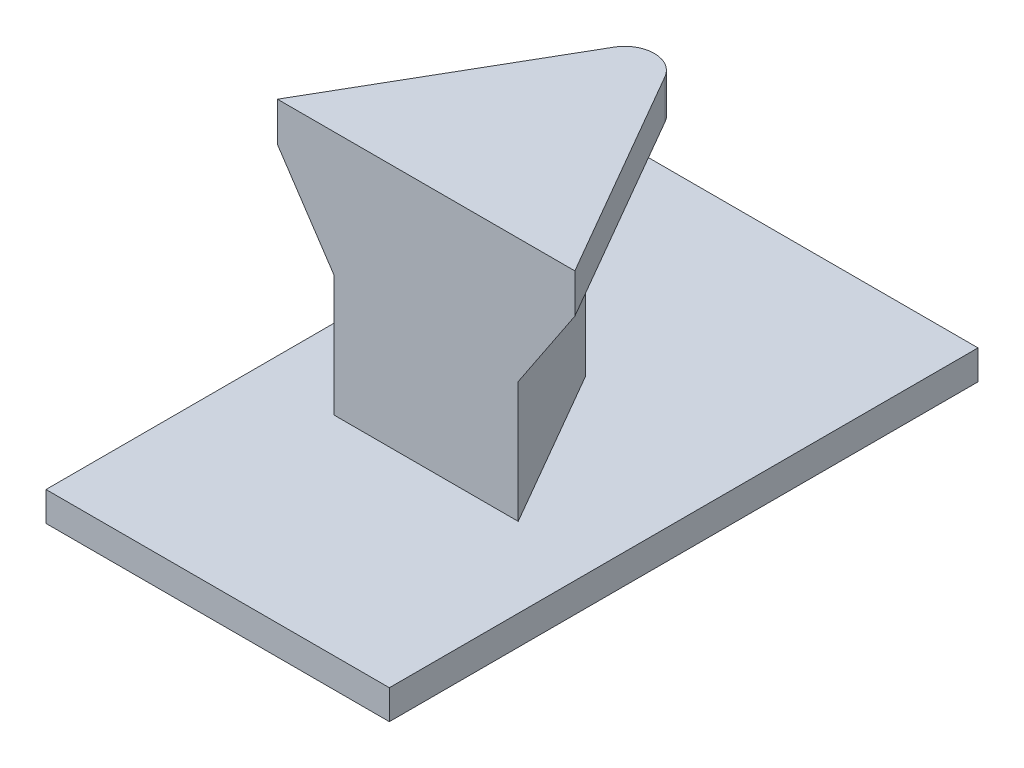
ISO-10303-21;
HEADER;
FILE_DESCRIPTION(('STEP AP214'),'2;1');
FILE_NAME('part.step','',(''),(''),'','','');
FILE_SCHEMA(('AUTOMOTIVE_DESIGN { 1 0 10303 214 1 1 1 1 }'));
ENDSEC;
DATA;
#1=APPLICATION_CONTEXT('core data for automotive mechanical design processes');
#2=APPLICATION_PROTOCOL_DEFINITION('international standard','automotive_design',2000,#1);
#3=PRODUCT_CONTEXT('',#1,'mechanical');
#4=PRODUCT('Part','Part','',(#3));
#5=PRODUCT_RELATED_PRODUCT_CATEGORY('part','',(#4));
#6=PRODUCT_DEFINITION_FORMATION('','',#4);
#7=PRODUCT_DEFINITION_CONTEXT('part definition',#1,'design');
#8=PRODUCT_DEFINITION('design','',#6,#7);
#9=PRODUCT_DEFINITION_SHAPE('','',#8);
#10=(LENGTH_UNIT() NAMED_UNIT(*) SI_UNIT(.MILLI.,.METRE.));
#11=(NAMED_UNIT(*) PLANE_ANGLE_UNIT() SI_UNIT($,.RADIAN.));
#12=(NAMED_UNIT(*) SI_UNIT($,.STERADIAN.) SOLID_ANGLE_UNIT());
#13=UNCERTAINTY_MEASURE_WITH_UNIT(LENGTH_MEASURE(1.E-05),#10,'distance_accuracy_value','');
#14=(GEOMETRIC_REPRESENTATION_CONTEXT(3) GLOBAL_UNCERTAINTY_ASSIGNED_CONTEXT((#13)) GLOBAL_UNIT_ASSIGNED_CONTEXT((#10,
#11,#12)) REPRESENTATION_CONTEXT('',''));
#15=CARTESIAN_POINT('',(0.,0.,0.));
#16=DIRECTION('',(0.,0.,1.));
#17=DIRECTION('',(1.,0.,0.));
#18=AXIS2_PLACEMENT_3D('',#15,#16,#17);
#19=CARTESIAN_POINT('',(0.,3.,0.));
#20=DIRECTION('',(0.,-1.,0.));
#21=DIRECTION('',(0.,0.,-1.));
#22=AXIS2_PLACEMENT_3D('',#19,#20,#21);
#23=PLANE('',#22);
#24=DIRECTION('',(1.,0.,0.));
#25=VECTOR('',#24,1.);
#26=CARTESIAN_POINT('',(-15.1554445662276,3.,8.75000000000007));
#27=LINE('',#26,#25);
#28=CARTESIAN_POINT('',(-9.38194187433142,3.,8.75000000000003));
#29=VERTEX_POINT('',#28);
#30=CARTESIAN_POINT('',(9.38194187433151,3.,8.7499999999999));
#31=VERTEX_POINT('',#30);
#32=EDGE_CURVE('E126',#29,#31,#27,.T.);
#33=ORIENTED_EDGE('',*,*,#32,.F.);
#34=DIRECTION('',(-0.5,0.,0.866025403784439));
#35=VECTOR('',#34,1.);
#36=CARTESIAN_POINT('',(-3.24759526419164,3.,-1.875));
#37=LINE('',#36,#35);
#38=CARTESIAN_POINT('',(0.,3.,-7.50000000000002));
#39=VERTEX_POINT('',#38);
#40=EDGE_CURVE('E132',#39,#29,#37,.T.);
#41=ORIENTED_EDGE('',*,*,#40,.F.);
#42=DIRECTION('',(-0.500000000000004,0.,-0.866025403784436));
#43=VECTOR('',#42,1.);
#44=CARTESIAN_POINT('',(3.24759526419169,3.,-1.87500000000005));
#45=LINE('',#44,#43);
#46=EDGE_CURVE('E120',#31,#39,#45,.T.);
#47=ORIENTED_EDGE('',*,*,#46,.F.);
#48=EDGE_LOOP('',(#33,#41,#47));
#49=FACE_BOUND('',#48,.T.);
#50=DIRECTION('',(0.,0.,-1.));
#51=VECTOR('',#50,1.);
#52=CARTESIAN_POINT('',(17.5,3.,30.));
#53=LINE('',#52,#51);
#54=CARTESIAN_POINT('',(17.5,3.,30.));
#55=VERTEX_POINT('',#54);
#56=CARTESIAN_POINT('',(17.5,3.,-30.));
#57=VERTEX_POINT('',#56);
#58=EDGE_CURVE('E158',#55,#57,#53,.T.);
#59=ORIENTED_EDGE('',*,*,#58,.T.);
#60=DIRECTION('',(-1.,0.,0.));
#61=VECTOR('',#60,1.);
#62=CARTESIAN_POINT('',(-17.5,3.,-30.));
#63=LINE('',#62,#61);
#64=CARTESIAN_POINT('',(-17.5,3.,-30.));
#65=VERTEX_POINT('',#64);
#66=EDGE_CURVE('E161',#57,#65,#63,.T.);
#67=ORIENTED_EDGE('',*,*,#66,.T.);
#68=DIRECTION('',(0.,0.,1.));
#69=VECTOR('',#68,1.);
#70=CARTESIAN_POINT('',(-17.5,3.,30.));
#71=LINE('',#70,#69);
#72=CARTESIAN_POINT('',(-17.5,3.,30.));
#73=VERTEX_POINT('',#72);
#74=EDGE_CURVE('E164',#65,#73,#71,.T.);
#75=ORIENTED_EDGE('',*,*,#74,.T.);
#76=DIRECTION('',(1.,0.,0.));
#77=VECTOR('',#76,1.);
#78=CARTESIAN_POINT('',(-17.5,3.,30.));
#79=LINE('',#78,#77);
#80=EDGE_CURVE('E166',#73,#55,#79,.T.);
#81=ORIENTED_EDGE('',*,*,#80,.T.);
#82=EDGE_LOOP('',(#59,#67,#75,#81));
#83=FACE_BOUND('',#82,.T.);
#84=ADVANCED_FACE('F33',(#49,#83),#23,.F.);
#85=CARTESIAN_POINT('',(17.5,3.,30.));
#86=DIRECTION('',(-1.,0.,0.));
#87=DIRECTION('',(0.,0.,1.));
#88=AXIS2_PLACEMENT_3D('',#85,#86,#87);
#89=PLANE('',#88);
#90=DIRECTION('',(0.,0.,-1.));
#91=VECTOR('',#90,1.);
#92=CARTESIAN_POINT('',(17.5,0.,30.));
#93=LINE('',#92,#91);
#94=CARTESIAN_POINT('',(17.5,0.,30.));
#95=VERTEX_POINT('',#94);
#96=CARTESIAN_POINT('',(17.5,0.,-30.));
#97=VERTEX_POINT('',#96);
#98=EDGE_CURVE('E157',#95,#97,#93,.T.);
#99=ORIENTED_EDGE('',*,*,#98,.T.);
#100=DIRECTION('',(0.,-1.,0.));
#101=VECTOR('',#100,1.);
#102=CARTESIAN_POINT('',(17.5,3.,-30.));
#103=LINE('',#102,#101);
#104=EDGE_CURVE('E184',#57,#97,#103,.T.);
#105=ORIENTED_EDGE('',*,*,#104,.F.);
#106=ORIENTED_EDGE('',*,*,#58,.F.);
#107=DIRECTION('',(0.,-1.,0.));
#108=VECTOR('',#107,1.);
#109=CARTESIAN_POINT('',(17.5,3.,30.));
#110=LINE('',#109,#108);
#111=EDGE_CURVE('E168',#55,#95,#110,.T.);
#112=ORIENTED_EDGE('',*,*,#111,.T.);
#113=EDGE_LOOP('',(#99,#105,#106,#112));
#114=FACE_BOUND('',#113,.T.);
#115=ADVANCED_FACE('F235',(#114),#89,.F.);
#116=CARTESIAN_POINT('',(-17.5,3.,-30.));
#117=DIRECTION('',(0.,0.,1.));
#118=DIRECTION('',(1.,0.,0.));
#119=AXIS2_PLACEMENT_3D('',#116,#117,#118);
#120=PLANE('',#119);
#121=DIRECTION('',(-1.,0.,0.));
#122=VECTOR('',#121,1.);
#123=CARTESIAN_POINT('',(-17.5,0.,-30.));
#124=LINE('',#123,#122);
#125=CARTESIAN_POINT('',(-17.5,0.,-30.));
#126=VERTEX_POINT('',#125);
#127=EDGE_CURVE('E171',#97,#126,#124,.T.);
#128=ORIENTED_EDGE('',*,*,#127,.T.);
#129=DIRECTION('',(0.,-1.,0.));
#130=VECTOR('',#129,1.);
#131=CARTESIAN_POINT('',(-17.5,3.,-30.));
#132=LINE('',#131,#130);
#133=EDGE_CURVE('E181',#65,#126,#132,.T.);
#134=ORIENTED_EDGE('',*,*,#133,.F.);
#135=ORIENTED_EDGE('',*,*,#66,.F.);
#136=ORIENTED_EDGE('',*,*,#104,.T.);
#137=EDGE_LOOP('',(#128,#134,#135,#136));
#138=FACE_BOUND('',#137,.T.);
#139=ADVANCED_FACE('F240',(#138),#120,.F.);
#140=CARTESIAN_POINT('',(-17.5,3.,30.));
#141=DIRECTION('',(1.,0.,0.));
#142=DIRECTION('',(0.,0.,-1.));
#143=AXIS2_PLACEMENT_3D('',#140,#141,#142);
#144=PLANE('',#143);
#145=DIRECTION('',(0.,0.,1.));
#146=VECTOR('',#145,1.);
#147=CARTESIAN_POINT('',(-17.5,0.,30.));
#148=LINE('',#147,#146);
#149=CARTESIAN_POINT('',(-17.5,0.,30.));
#150=VERTEX_POINT('',#149);
#151=EDGE_CURVE('E173',#126,#150,#148,.T.);
#152=ORIENTED_EDGE('',*,*,#151,.T.);
#153=DIRECTION('',(0.,-1.,0.));
#154=VECTOR('',#153,1.);
#155=CARTESIAN_POINT('',(-17.5,3.,30.));
#156=LINE('',#155,#154);
#157=EDGE_CURVE('E178',#73,#150,#156,.T.);
#158=ORIENTED_EDGE('',*,*,#157,.F.);
#159=ORIENTED_EDGE('',*,*,#74,.F.);
#160=ORIENTED_EDGE('',*,*,#133,.T.);
#161=EDGE_LOOP('',(#152,#158,#159,#160));
#162=FACE_BOUND('',#161,.T.);
#163=ADVANCED_FACE('F252',(#162),#144,.F.);
#164=CARTESIAN_POINT('',(-17.5,3.,30.));
#165=DIRECTION('',(0.,0.,-1.));
#166=DIRECTION('',(-1.,0.,0.));
#167=AXIS2_PLACEMENT_3D('',#164,#165,#166);
#168=PLANE('',#167);
#169=DIRECTION('',(1.,0.,0.));
#170=VECTOR('',#169,1.);
#171=CARTESIAN_POINT('',(-17.5,0.,30.));
#172=LINE('',#171,#170);
#173=EDGE_CURVE('E162',#150,#95,#172,.T.);
#174=ORIENTED_EDGE('',*,*,#173,.T.);
#175=ORIENTED_EDGE('',*,*,#111,.F.);
#176=ORIENTED_EDGE('',*,*,#80,.F.);
#177=ORIENTED_EDGE('',*,*,#157,.T.);
#178=EDGE_LOOP('',(#174,#175,#176,#177));
#179=FACE_BOUND('',#178,.T.);
#180=ADVANCED_FACE('F248',(#179),#168,.F.);
#181=CARTESIAN_POINT('',(0.,0.,0.));
#182=DIRECTION('',(0.,-1.,0.));
#183=DIRECTION('',(0.,0.,-1.));
#184=AXIS2_PLACEMENT_3D('',#181,#182,#183);
#185=PLANE('',#184);
#186=ORIENTED_EDGE('',*,*,#98,.F.);
#187=ORIENTED_EDGE('',*,*,#173,.F.);
#188=ORIENTED_EDGE('',*,*,#151,.F.);
#189=ORIENTED_EDGE('',*,*,#127,.F.);
#190=EDGE_LOOP('',(#186,#187,#188,#189));
#191=FACE_BOUND('',#190,.T.);
#192=ADVANCED_FACE('F245',(#191),#185,.T.);
#193=CARTESIAN_POINT('',(0.,28.,-11.5));
#194=DIRECTION('',(0.,-1.,0.));
#195=DIRECTION('',(0.,0.,-1.));
#196=AXIS2_PLACEMENT_3D('',#193,#194,#195);
#197=CYLINDRICAL_SURFACE('',#196,3.);
#198=DIRECTION('',(0.,-1.,0.));
#199=VECTOR('',#198,1.);
#200=CARTESIAN_POINT('',(2.59807621135335,28.,-13.));
#201=LINE('',#200,#199);
#202=CARTESIAN_POINT('',(2.59807621135335,28.,-13.));
#203=VERTEX_POINT('',#202);
#204=CARTESIAN_POINT('',(2.59807621135335,24.0000000000001,-13.));
#205=VERTEX_POINT('',#204);
#206=EDGE_CURVE('E146',#203,#205,#201,.T.);
#207=ORIENTED_EDGE('',*,*,#206,.T.);
#208=CARTESIAN_POINT('',(0.,18.8038475772935,-11.5));
#209=DIRECTION('',(-0.749999999999995,0.500000000000006,0.433012701892221));
#210=DIRECTION('',(-0.433012701892223,-0.866025403784436,0.250000000000005));
#211=AXIS2_PLACEMENT_3D('',#208,#209,#210);
#212=ELLIPSE('',#211,5.99999999999993,3.);
#213=CARTESIAN_POINT('',(0.,21.4019237886468,-14.5));
#214=VERTEX_POINT('',#213);
#215=EDGE_CURVE('E56',#205,#214,#212,.T.);
#216=ORIENTED_EDGE('',*,*,#215,.T.);
#217=CARTESIAN_POINT('',(0.,18.8038475772935,-11.5));
#218=DIRECTION('',(0.749999999999998,0.500000000000006,0.433012701892216));
#219=DIRECTION('',(0.433012701892225,-0.866025403784435,0.250000000000002));
#220=AXIS2_PLACEMENT_3D('',#217,#218,#219);
#221=ELLIPSE('',#220,5.99999999999993,3.);
#222=CARTESIAN_POINT('',(-2.59807621135332,24.0000000000001,-13.));
#223=VERTEX_POINT('',#222);
#224=EDGE_CURVE('E194',#214,#223,#221,.T.);
#225=ORIENTED_EDGE('',*,*,#224,.T.);
#226=DIRECTION('',(0.,-1.,0.));
#227=VECTOR('',#226,1.);
#228=CARTESIAN_POINT('',(-2.59807621135332,28.,-13.));
#229=LINE('',#228,#227);
#230=CARTESIAN_POINT('',(-2.59807621135332,28.,-13.));
#231=VERTEX_POINT('',#230);
#232=EDGE_CURVE('E154',#231,#223,#229,.T.);
#233=ORIENTED_EDGE('',*,*,#232,.F.);
#234=CARTESIAN_POINT('',(0.,28.,-11.5));
#235=DIRECTION('',(0.,1.,0.));
#236=DIRECTION('',(0.,0.,1.));
#237=AXIS2_PLACEMENT_3D('',#234,#235,#236);
#238=CIRCLE('',#237,3.);
#239=EDGE_CURVE('E137',#203,#231,#238,.T.);
#240=ORIENTED_EDGE('',*,*,#239,.F.);
#241=EDGE_LOOP('',(#207,#216,#225,#233,#240));
#242=FACE_BOUND('',#241,.T.);
#243=ADVANCED_FACE('F226',(#242),#197,.T.);
#244=CARTESIAN_POINT('',(-2.59807621135332,28.,-13.));
#245=DIRECTION('',(0.86602540378444,0.,0.499999999999998));
#246=DIRECTION('',(0.499999999999998,0.,-0.86602540378444));
#247=AXIS2_PLACEMENT_3D('',#244,#245,#246);
#248=PLANE('',#247);
#249=ORIENTED_EDGE('',*,*,#232,.T.);
#250=DIRECTION('',(-0.499999999999998,0.,0.86602540378444));
#251=VECTOR('',#250,1.);
#252=CARTESIAN_POINT('',(-2.59807621135332,24.0000000000001,-13.));
#253=LINE('',#252,#251);
#254=CARTESIAN_POINT('',(-15.1554445662276,24.0000000000001,8.75000000000007));
#255=VERTEX_POINT('',#254);
#256=EDGE_CURVE('E197',#223,#255,#253,.T.);
#257=ORIENTED_EDGE('',*,*,#256,.T.);
#258=DIRECTION('',(0.,-1.,0.));
#259=VECTOR('',#258,1.);
#260=CARTESIAN_POINT('',(-15.1554445662276,28.,8.75000000000007));
#261=LINE('',#260,#259);
#262=CARTESIAN_POINT('',(-15.1554445662276,28.,8.75000000000007));
#263=VERTEX_POINT('',#262);
#264=EDGE_CURVE('E151',#263,#255,#261,.T.);
#265=ORIENTED_EDGE('',*,*,#264,.F.);
#266=DIRECTION('',(-0.499999999999998,0.,0.86602540378444));
#267=VECTOR('',#266,1.);
#268=CARTESIAN_POINT('',(-2.59807621135332,28.,-13.));
#269=LINE('',#268,#267);
#270=EDGE_CURVE('E140',#231,#263,#269,.T.);
#271=ORIENTED_EDGE('',*,*,#270,.F.);
#272=EDGE_LOOP('',(#249,#257,#265,#271));
#273=FACE_BOUND('',#272,.T.);
#274=ADVANCED_FACE('F202',(#273),#248,.F.);
#275=CARTESIAN_POINT('',(-15.1554445662276,28.,8.75000000000007));
#276=DIRECTION('',(0.,0.,-1.));
#277=DIRECTION('',(-1.,0.,0.));
#278=AXIS2_PLACEMENT_3D('',#275,#276,#277);
#279=PLANE('',#278);
#280=DIRECTION('',(0.,-1.,0.));
#281=VECTOR('',#280,1.);
#282=CARTESIAN_POINT('',(9.38194187433151,4.,8.7499999999999));
#283=LINE('',#282,#281);
#284=CARTESIAN_POINT('',(9.3819418743315,15.3397459621558,8.7499999999999));
#285=VERTEX_POINT('',#284);
#286=EDGE_CURVE('E117',#285,#31,#283,.T.);
#287=ORIENTED_EDGE('',*,*,#286,.F.);
#288=DIRECTION('',(-0.554700196225234,-0.83205029433784,0.));
#289=VECTOR('',#288,1.);
#290=CARTESIAN_POINT('',(0.516145402192499,2.04105125394749,8.74999999999996));
#291=LINE('',#290,#289);
#292=CARTESIAN_POINT('',(15.1554445662278,24.0000000000001,8.74999999999986));
#293=VERTEX_POINT('',#292);
#294=EDGE_CURVE('E189',#285,#293,#291,.F.);
#295=ORIENTED_EDGE('',*,*,#294,.T.);
#296=DIRECTION('',(0.,-1.,0.));
#297=VECTOR('',#296,1.);
#298=CARTESIAN_POINT('',(15.1554445662278,28.,8.74999999999986));
#299=LINE('',#298,#297);
#300=CARTESIAN_POINT('',(15.1554445662278,28.,8.74999999999986));
#301=VERTEX_POINT('',#300);
#302=EDGE_CURVE('E148',#301,#293,#299,.T.);
#303=ORIENTED_EDGE('',*,*,#302,.F.);
#304=DIRECTION('',(1.,0.,0.));
#305=VECTOR('',#304,1.);
#306=CARTESIAN_POINT('',(-15.1554445662276,28.,8.75000000000007));
#307=LINE('',#306,#305);
#308=EDGE_CURVE('E209',#263,#301,#307,.T.);
#309=ORIENTED_EDGE('',*,*,#308,.F.);
#310=ORIENTED_EDGE('',*,*,#264,.T.);
#311=DIRECTION('',(-0.554700196225236,0.832050294337839,0.));
#312=VECTOR('',#311,1.);
#313=CARTESIAN_POINT('',(-0.516145402192309,2.04105125394747,8.74999999999997));
#314=LINE('',#313,#312);
#315=CARTESIAN_POINT('',(-9.38194187433142,15.3397459621559,8.75000000000003));
#316=VERTEX_POINT('',#315);
#317=EDGE_CURVE('E187',#255,#316,#314,.F.);
#318=ORIENTED_EDGE('',*,*,#317,.T.);
#319=DIRECTION('',(0.,-1.,0.));
#320=VECTOR('',#319,1.);
#321=CARTESIAN_POINT('',(-9.38194187433142,4.,8.75000000000003));
#322=LINE('',#321,#320);
#323=EDGE_CURVE('E127',#316,#29,#322,.T.);
#324=ORIENTED_EDGE('',*,*,#323,.T.);
#325=ORIENTED_EDGE('',*,*,#32,.T.);
#326=EDGE_LOOP('',(#287,#295,#303,#309,#310,#318,#324,#325));
#327=FACE_BOUND('',#326,.T.);
#328=ADVANCED_FACE('F135',(#327),#279,.F.);
#329=CARTESIAN_POINT('',(15.1554445662278,28.,8.74999999999986));
#330=DIRECTION('',(-0.866025403784436,0.,0.500000000000004));
#331=DIRECTION('',(0.500000000000004,0.,0.866025403784437));
#332=AXIS2_PLACEMENT_3D('',#329,#330,#331);
#333=PLANE('',#332);
#334=ORIENTED_EDGE('',*,*,#302,.T.);
#335=DIRECTION('',(-0.500000000000004,0.,-0.866025403784437));
#336=VECTOR('',#335,1.);
#337=CARTESIAN_POINT('',(15.1554445662278,24.0000000000001,8.74999999999986));
#338=LINE('',#337,#336);
#339=EDGE_CURVE('E191',#293,#205,#338,.T.);
#340=ORIENTED_EDGE('',*,*,#339,.T.);
#341=ORIENTED_EDGE('',*,*,#206,.F.);
#342=DIRECTION('',(-0.500000000000004,0.,-0.866025403784436));
#343=VECTOR('',#342,1.);
#344=CARTESIAN_POINT('',(15.1554445662278,28.,8.74999999999986));
#345=LINE('',#344,#343);
#346=EDGE_CURVE('E144',#301,#203,#345,.T.);
#347=ORIENTED_EDGE('',*,*,#346,.F.);
#348=EDGE_LOOP('',(#334,#340,#341,#347));
#349=FACE_BOUND('',#348,.T.);
#350=ADVANCED_FACE('F224',(#349),#333,.F.);
#351=CARTESIAN_POINT('',(0.,28.,-11.5));
#352=DIRECTION('',(0.,1.,0.));
#353=DIRECTION('',(0.,0.,1.));
#354=AXIS2_PLACEMENT_3D('',#351,#352,#353);
#355=PLANE('',#354);
#356=ORIENTED_EDGE('',*,*,#239,.T.);
#357=ORIENTED_EDGE('',*,*,#270,.T.);
#358=ORIENTED_EDGE('',*,*,#308,.T.);
#359=ORIENTED_EDGE('',*,*,#346,.T.);
#360=EDGE_LOOP('',(#356,#357,#358,#359));
#361=FACE_BOUND('',#360,.T.);
#362=ADVANCED_FACE('F221',(#361),#355,.T.);
#363=CARTESIAN_POINT('',(3.24759526419169,4.,-1.87500000000005));
#364=DIRECTION('',(-0.866025403784436,0.,0.500000000000004));
#365=DIRECTION('',(0.500000000000004,0.,0.866025403784436));
#366=AXIS2_PLACEMENT_3D('',#363,#364,#365);
#367=PLANE('',#366);
#368=ORIENTED_EDGE('',*,*,#46,.T.);
#369=DIRECTION('',(0.,-1.,0.));
#370=VECTOR('',#369,1.);
#371=CARTESIAN_POINT('',(0.,4.,-7.50000000000002));
#372=LINE('',#371,#370);
#373=CARTESIAN_POINT('',(0.,15.3397459621558,-7.50000000000002));
#374=VERTEX_POINT('',#373);
#375=EDGE_CURVE('E49',#374,#39,#372,.T.);
#376=ORIENTED_EDGE('',*,*,#375,.F.);
#377=DIRECTION('',(-0.500000000000004,0.,-0.866025403784436));
#378=VECTOR('',#377,1.);
#379=CARTESIAN_POINT('',(3.24759526419169,15.3397459621558,-1.87500000000005));
#380=LINE('',#379,#378);
#381=EDGE_CURVE('E42',#374,#285,#380,.F.);
#382=ORIENTED_EDGE('',*,*,#381,.T.);
#383=ORIENTED_EDGE('',*,*,#286,.T.);
#384=EDGE_LOOP('',(#368,#376,#382,#383));
#385=FACE_BOUND('',#384,.T.);
#386=ADVANCED_FACE('F119',(#385),#367,.F.);
#387=CARTESIAN_POINT('',(-3.24759526419164,4.,-1.875));
#388=DIRECTION('',(0.866025403784439,0.,0.5));
#389=DIRECTION('',(0.5,0.,-0.866025403784439));
#390=AXIS2_PLACEMENT_3D('',#387,#388,#389);
#391=PLANE('',#390);
#392=ORIENTED_EDGE('',*,*,#40,.T.);
#393=ORIENTED_EDGE('',*,*,#323,.F.);
#394=DIRECTION('',(-0.5,0.,0.866025403784439));
#395=VECTOR('',#394,1.);
#396=CARTESIAN_POINT('',(-3.24759526419161,15.3397459621559,-1.87500000000004));
#397=LINE('',#396,#395);
#398=EDGE_CURVE('E11',#316,#374,#397,.F.);
#399=ORIENTED_EDGE('',*,*,#398,.T.);
#400=ORIENTED_EDGE('',*,*,#375,.T.);
#401=EDGE_LOOP('',(#392,#393,#399,#400));
#402=FACE_BOUND('',#401,.T.);
#403=ADVANCED_FACE('F213',(#402),#391,.F.);
#404=CARTESIAN_POINT('',(2.42227771688638,4.,1.39850269189638));
#405=DIRECTION('',(0.749999999999998,0.500000000000006,0.433012701892216));
#406=DIRECTION('',(0.499999999999998,0.,-0.86602540378444));
#407=AXIS2_PLACEMENT_3D('',#404,#405,#406);
#408=PLANE('',#407);
#409=ORIENTED_EDGE('',*,*,#256,.F.);
#410=ORIENTED_EDGE('',*,*,#224,.F.);
#411=DIRECTION('',(0.,0.654653670707972,-0.755928946018459));
#412=VECTOR('',#411,1.);
#413=CARTESIAN_POINT('',(0.,6.07623804304543,3.19657758147734));
#414=LINE('',#413,#412);
#415=EDGE_CURVE('E37',#374,#214,#414,.T.);
#416=ORIENTED_EDGE('',*,*,#415,.F.);
#417=ORIENTED_EDGE('',*,*,#398,.F.);
#418=ORIENTED_EDGE('',*,*,#317,.F.);
#419=EDGE_LOOP('',(#409,#410,#416,#417,#418));
#420=FACE_BOUND('',#419,.T.);
#421=ADVANCED_FACE('F35',(#420),#408,.F.);
#422=CARTESIAN_POINT('',(-2.42227771688628,4.,1.39850269189634));
#423=DIRECTION('',(-0.749999999999995,0.500000000000006,0.433012701892221));
#424=DIRECTION('',(0.500000000000004,0.,0.866025403784437));
#425=AXIS2_PLACEMENT_3D('',#422,#423,#424);
#426=PLANE('',#425);
#427=ORIENTED_EDGE('',*,*,#215,.F.);
#428=ORIENTED_EDGE('',*,*,#339,.F.);
#429=ORIENTED_EDGE('',*,*,#294,.F.);
#430=ORIENTED_EDGE('',*,*,#381,.F.);
#431=ORIENTED_EDGE('',*,*,#415,.T.);
#432=EDGE_LOOP('',(#427,#428,#429,#430,#431));
#433=FACE_BOUND('',#432,.T.);
#434=ADVANCED_FACE('F228',(#433),#426,.F.);
#435=CLOSED_SHELL('',(#84,#115,#139,#163,#180,#192,#243,#274,#328,#350,#362,#386,#403,#421,#434));
#436=MANIFOLD_SOLID_BREP('B2',#435);
#437=ADVANCED_BREP_SHAPE_REPRESENTATION('',(#18,#436),#14);
#438=SHAPE_DEFINITION_REPRESENTATION(#9,#437);
ENDSEC;
END-ISO-10303-21;
